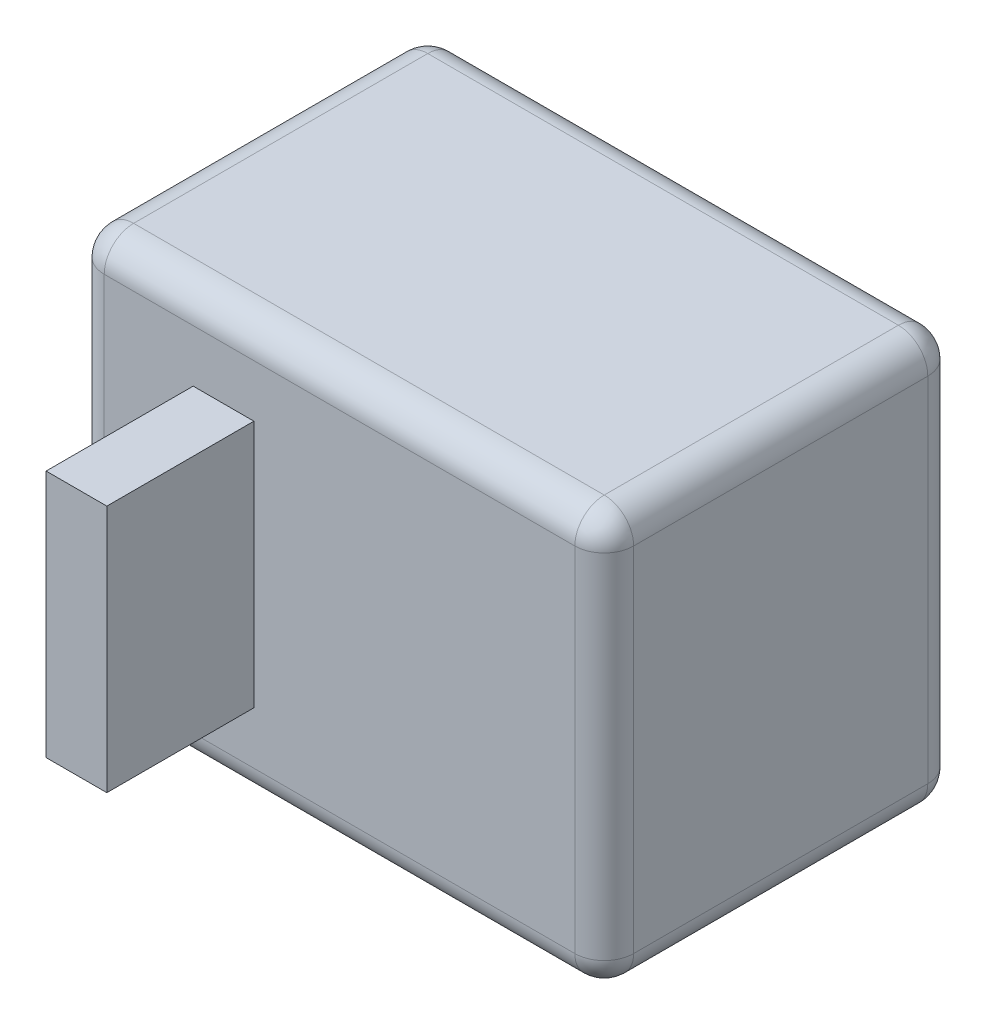
ISO-10303-21;
HEADER;
FILE_DESCRIPTION(('STEP AP214'),'2;1');
FILE_NAME('part.step','',(''),(''),'','','');
FILE_SCHEMA(('AUTOMOTIVE_DESIGN { 1 0 10303 214 1 1 1 1 }'));
ENDSEC;
DATA;
#1=APPLICATION_CONTEXT('core data for automotive mechanical design processes');
#2=APPLICATION_PROTOCOL_DEFINITION('international standard','automotive_design',2000,#1);
#3=PRODUCT_CONTEXT('',#1,'mechanical');
#4=PRODUCT('Part','Part','',(#3));
#5=PRODUCT_RELATED_PRODUCT_CATEGORY('part','',(#4));
#6=PRODUCT_DEFINITION_FORMATION('','',#4);
#7=PRODUCT_DEFINITION_CONTEXT('part definition',#1,'design');
#8=PRODUCT_DEFINITION('design','',#6,#7);
#9=PRODUCT_DEFINITION_SHAPE('','',#8);
#10=(LENGTH_UNIT() NAMED_UNIT(*) SI_UNIT(.MILLI.,.METRE.));
#11=(NAMED_UNIT(*) PLANE_ANGLE_UNIT() SI_UNIT($,.RADIAN.));
#12=(NAMED_UNIT(*) SI_UNIT($,.STERADIAN.) SOLID_ANGLE_UNIT());
#13=UNCERTAINTY_MEASURE_WITH_UNIT(LENGTH_MEASURE(1.E-05),#10,'distance_accuracy_value','');
#14=(GEOMETRIC_REPRESENTATION_CONTEXT(3) GLOBAL_UNCERTAINTY_ASSIGNED_CONTEXT((#13)) GLOBAL_UNIT_ASSIGNED_CONTEXT((#10,
#11,#12)) REPRESENTATION_CONTEXT('',''));
#15=CARTESIAN_POINT('',(0.,0.,0.));
#16=DIRECTION('',(0.,0.,1.));
#17=DIRECTION('',(1.,0.,0.));
#18=AXIS2_PLACEMENT_3D('',#15,#16,#17);
#19=CARTESIAN_POINT('',(0.,0.,12.));
#20=DIRECTION('',(0.,0.,1.));
#21=DIRECTION('',(1.,0.,0.));
#22=AXIS2_PLACEMENT_3D('',#19,#20,#21);
#23=PLANE('',#22);
#24=DIRECTION('',(0.,1.,0.));
#25=VECTOR('',#24,1.);
#26=CARTESIAN_POINT('',(7.99999999999999,7.00000000000001,12.));
#27=LINE('',#26,#25);
#28=CARTESIAN_POINT('',(8.,-5.99999999999999,12.));
#29=VERTEX_POINT('',#28);
#30=CARTESIAN_POINT('',(7.99999999999999,6.00000000000001,12.));
#31=VERTEX_POINT('',#30);
#32=EDGE_CURVE('E174',#29,#31,#27,.T.);
#33=ORIENTED_EDGE('',*,*,#32,.T.);
#34=DIRECTION('',(-1.,0.,0.));
#35=VECTOR('',#34,1.);
#36=CARTESIAN_POINT('',(-9.00000000000001,6.00000000000001,12.));
#37=LINE('',#36,#35);
#38=CARTESIAN_POINT('',(-8.,6.00000000000001,12.));
#39=VERTEX_POINT('',#38);
#40=EDGE_CURVE('E183',#31,#39,#37,.T.);
#41=ORIENTED_EDGE('',*,*,#40,.T.);
#42=DIRECTION('',(0.,-1.,0.));
#43=VECTOR('',#42,1.);
#44=CARTESIAN_POINT('',(-8.,-6.99999999999999,12.));
#45=LINE('',#44,#43);
#46=CARTESIAN_POINT('',(-8.,-5.99999999999999,12.));
#47=VERTEX_POINT('',#46);
#48=EDGE_CURVE('E181',#39,#47,#45,.T.);
#49=ORIENTED_EDGE('',*,*,#48,.T.);
#50=DIRECTION('',(1.,0.,0.));
#51=VECTOR('',#50,1.);
#52=CARTESIAN_POINT('',(9.,-5.99999999999999,12.));
#53=LINE('',#52,#51);
#54=EDGE_CURVE('E172',#47,#29,#53,.T.);
#55=ORIENTED_EDGE('',*,*,#54,.T.);
#56=EDGE_LOOP('',(#33,#41,#49,#55));
#57=FACE_BOUND('',#56,.T.);
#58=DIRECTION('',(-1.,0.,0.));
#59=VECTOR('',#58,1.);
#60=CARTESIAN_POINT('',(-4.97569113138166,4.21909512818599,12.));
#61=LINE('',#60,#59);
#62=CARTESIAN_POINT('',(-2.91081633923415,4.21909512818599,12.));
#63=VERTEX_POINT('',#62);
#64=CARTESIAN_POINT('',(-4.97569113138166,4.21909512818599,12.));
#65=VERTEX_POINT('',#64);
#66=EDGE_CURVE('E297',#63,#65,#61,.T.);
#67=ORIENTED_EDGE('',*,*,#66,.F.);
#68=DIRECTION('',(0.,1.,0.));
#69=VECTOR('',#68,1.);
#70=CARTESIAN_POINT('',(-2.91081633923415,4.21909512818599,12.));
#71=LINE('',#70,#69);
#72=CARTESIAN_POINT('',(-2.91081633923415,-4.21909512818599,12.));
#73=VERTEX_POINT('',#72);
#74=EDGE_CURVE('E170',#73,#63,#71,.T.);
#75=ORIENTED_EDGE('',*,*,#74,.F.);
#76=DIRECTION('',(1.,0.,0.));
#77=VECTOR('',#76,1.);
#78=CARTESIAN_POINT('',(-4.97569113138166,-4.21909512818599,12.));
#79=LINE('',#78,#77);
#80=CARTESIAN_POINT('',(-4.97569113138166,-4.21909512818599,12.));
#81=VERTEX_POINT('',#80);
#82=EDGE_CURVE('E166',#81,#73,#79,.T.);
#83=ORIENTED_EDGE('',*,*,#82,.F.);
#84=DIRECTION('',(0.,-1.,0.));
#85=VECTOR('',#84,1.);
#86=CARTESIAN_POINT('',(-4.97569113138166,4.21909512818599,12.));
#87=LINE('',#86,#85);
#88=EDGE_CURVE('E299',#65,#81,#87,.T.);
#89=ORIENTED_EDGE('',*,*,#88,.F.);
#90=EDGE_LOOP('',(#67,#75,#83,#89));
#91=FACE_BOUND('',#90,.T.);
#92=ADVANCED_FACE('F35',(#57,#91),#23,.T.);
#93=CARTESIAN_POINT('',(8.99999999999999,7.00000000000001,12.));
#94=DIRECTION('',(-1.,0.,0.));
#95=DIRECTION('',(0.,-1.,0.));
#96=AXIS2_PLACEMENT_3D('',#93,#94,#95);
#97=PLANE('',#96);
#98=DIRECTION('',(0.,0.,-1.));
#99=VECTOR('',#98,1.);
#100=CARTESIAN_POINT('',(8.99999999999999,6.00000000000001,12.));
#101=LINE('',#100,#99);
#102=CARTESIAN_POINT('',(8.99999999999999,6.00000000000001,1.));
#103=VERTEX_POINT('',#102);
#104=CARTESIAN_POINT('',(8.99999999999999,6.00000000000001,11.));
#105=VERTEX_POINT('',#104);
#106=EDGE_CURVE('E217',#103,#105,#101,.F.);
#107=ORIENTED_EDGE('',*,*,#106,.T.);
#108=DIRECTION('',(0.,1.,0.));
#109=VECTOR('',#108,1.);
#110=CARTESIAN_POINT('',(9.,-6.99999999999999,11.));
#111=LINE('',#110,#109);
#112=CARTESIAN_POINT('',(9.,-5.99999999999999,11.));
#113=VERTEX_POINT('',#112);
#114=EDGE_CURVE('E219',#105,#113,#111,.F.);
#115=ORIENTED_EDGE('',*,*,#114,.T.);
#116=DIRECTION('',(0.,0.,-1.));
#117=VECTOR('',#116,1.);
#118=CARTESIAN_POINT('',(9.,-5.99999999999999,12.));
#119=LINE('',#118,#117);
#120=CARTESIAN_POINT('',(9.,-5.99999999999999,1.));
#121=VERTEX_POINT('',#120);
#122=EDGE_CURVE('E213',#113,#121,#119,.T.);
#123=ORIENTED_EDGE('',*,*,#122,.T.);
#124=DIRECTION('',(0.,1.,0.));
#125=VECTOR('',#124,1.);
#126=CARTESIAN_POINT('',(8.99999999999999,7.00000000000001,1.));
#127=LINE('',#126,#125);
#128=EDGE_CURVE('E215',#121,#103,#127,.T.);
#129=ORIENTED_EDGE('',*,*,#128,.T.);
#130=EDGE_LOOP('',(#107,#115,#123,#129));
#131=FACE_BOUND('',#130,.T.);
#132=ADVANCED_FACE('F317',(#131),#97,.F.);
#133=CARTESIAN_POINT('',(-9.00000000000001,7.00000000000001,12.));
#134=DIRECTION('',(0.,-1.,0.));
#135=DIRECTION('',(0.,0.,-1.));
#136=AXIS2_PLACEMENT_3D('',#133,#134,#135);
#137=PLANE('',#136);
#138=DIRECTION('',(-1.,0.,0.));
#139=VECTOR('',#138,1.);
#140=CARTESIAN_POINT('',(-9.00000000000001,7.00000000000001,1.));
#141=LINE('',#140,#139);
#142=CARTESIAN_POINT('',(7.99999999999999,7.00000000000001,1.));
#143=VERTEX_POINT('',#142);
#144=CARTESIAN_POINT('',(-8.,7.00000000000001,1.));
#145=VERTEX_POINT('',#144);
#146=EDGE_CURVE('E188',#143,#145,#141,.T.);
#147=ORIENTED_EDGE('',*,*,#146,.T.);
#148=DIRECTION('',(0.,0.,-1.));
#149=VECTOR('',#148,1.);
#150=CARTESIAN_POINT('',(-8.,7.00000000000001,12.));
#151=LINE('',#150,#149);
#152=CARTESIAN_POINT('',(-8.,7.00000000000001,11.));
#153=VERTEX_POINT('',#152);
#154=EDGE_CURVE('E193',#145,#153,#151,.F.);
#155=ORIENTED_EDGE('',*,*,#154,.T.);
#156=DIRECTION('',(-1.,0.,0.));
#157=VECTOR('',#156,1.);
#158=CARTESIAN_POINT('',(8.99999999999999,7.00000000000001,11.));
#159=LINE('',#158,#157);
#160=CARTESIAN_POINT('',(7.99999999999999,7.00000000000001,11.));
#161=VERTEX_POINT('',#160);
#162=EDGE_CURVE('E190',#153,#161,#159,.F.);
#163=ORIENTED_EDGE('',*,*,#162,.T.);
#164=DIRECTION('',(0.,0.,-1.));
#165=VECTOR('',#164,1.);
#166=CARTESIAN_POINT('',(7.99999999999999,7.00000000000001,12.));
#167=LINE('',#166,#165);
#168=EDGE_CURVE('E186',#161,#143,#167,.T.);
#169=ORIENTED_EDGE('',*,*,#168,.T.);
#170=EDGE_LOOP('',(#147,#155,#163,#169));
#171=FACE_BOUND('',#170,.T.);
#172=ADVANCED_FACE('F323',(#171),#137,.F.);
#173=CARTESIAN_POINT('',(-9.00000000000001,7.00000000000001,12.));
#174=DIRECTION('',(1.,0.,0.));
#175=DIRECTION('',(0.,1.,0.));
#176=AXIS2_PLACEMENT_3D('',#173,#174,#175);
#177=PLANE('',#176);
#178=DIRECTION('',(0.,-1.,0.));
#179=VECTOR('',#178,1.);
#180=CARTESIAN_POINT('',(-9.00000000000001,7.00000000000001,11.));
#181=LINE('',#180,#179);
#182=CARTESIAN_POINT('',(-9.,-5.99999999999999,11.));
#183=VERTEX_POINT('',#182);
#184=CARTESIAN_POINT('',(-9.00000000000001,6.00000000000001,11.));
#185=VERTEX_POINT('',#184);
#186=EDGE_CURVE('E208',#183,#185,#181,.F.);
#187=ORIENTED_EDGE('',*,*,#186,.T.);
#188=DIRECTION('',(0.,0.,-1.));
#189=VECTOR('',#188,1.);
#190=CARTESIAN_POINT('',(-9.00000000000001,6.00000000000001,12.));
#191=LINE('',#190,#189);
#192=CARTESIAN_POINT('',(-9.00000000000001,6.00000000000001,1.));
#193=VERTEX_POINT('',#192);
#194=EDGE_CURVE('E210',#185,#193,#191,.T.);
#195=ORIENTED_EDGE('',*,*,#194,.T.);
#196=DIRECTION('',(0.,-1.,0.));
#197=VECTOR('',#196,1.);
#198=CARTESIAN_POINT('',(-9.00000000000001,7.00000000000001,1.));
#199=LINE('',#198,#197);
#200=CARTESIAN_POINT('',(-9.,-5.99999999999999,1.));
#201=VERTEX_POINT('',#200);
#202=EDGE_CURVE('E206',#193,#201,#199,.T.);
#203=ORIENTED_EDGE('',*,*,#202,.T.);
#204=DIRECTION('',(0.,0.,-1.));
#205=VECTOR('',#204,1.);
#206=CARTESIAN_POINT('',(-9.,-5.99999999999999,12.));
#207=LINE('',#206,#205);
#208=EDGE_CURVE('E204',#201,#183,#207,.F.);
#209=ORIENTED_EDGE('',*,*,#208,.T.);
#210=EDGE_LOOP('',(#187,#195,#203,#209));
#211=FACE_BOUND('',#210,.T.);
#212=ADVANCED_FACE('F336',(#211),#177,.F.);
#213=CARTESIAN_POINT('',(-9.,-6.99999999999999,12.));
#214=DIRECTION('',(0.,1.,0.));
#215=DIRECTION('',(0.,0.,1.));
#216=AXIS2_PLACEMENT_3D('',#213,#214,#215);
#217=PLANE('',#216);
#218=DIRECTION('',(1.,0.,0.));
#219=VECTOR('',#218,1.);
#220=CARTESIAN_POINT('',(-9.,-6.99999999999999,11.));
#221=LINE('',#220,#219);
#222=CARTESIAN_POINT('',(8.,-6.99999999999999,11.));
#223=VERTEX_POINT('',#222);
#224=CARTESIAN_POINT('',(-8.,-6.99999999999999,11.));
#225=VERTEX_POINT('',#224);
#226=EDGE_CURVE('E44',#223,#225,#221,.F.);
#227=ORIENTED_EDGE('',*,*,#226,.T.);
#228=DIRECTION('',(0.,0.,-1.));
#229=VECTOR('',#228,1.);
#230=CARTESIAN_POINT('',(-8.,-6.99999999999999,12.));
#231=LINE('',#230,#229);
#232=CARTESIAN_POINT('',(-8.,-6.99999999999999,1.));
#233=VERTEX_POINT('',#232);
#234=EDGE_CURVE('E11',#225,#233,#231,.T.);
#235=ORIENTED_EDGE('',*,*,#234,.T.);
#236=DIRECTION('',(1.,0.,0.));
#237=VECTOR('',#236,1.);
#238=CARTESIAN_POINT('',(-9.,-6.99999999999999,1.));
#239=LINE('',#238,#237);
#240=CARTESIAN_POINT('',(8.,-6.99999999999999,1.));
#241=VERTEX_POINT('',#240);
#242=EDGE_CURVE('E222',#233,#241,#239,.T.);
#243=ORIENTED_EDGE('',*,*,#242,.T.);
#244=DIRECTION('',(0.,0.,-1.));
#245=VECTOR('',#244,1.);
#246=CARTESIAN_POINT('',(8.,-6.99999999999999,12.));
#247=LINE('',#246,#245);
#248=EDGE_CURVE('E55',#241,#223,#247,.F.);
#249=ORIENTED_EDGE('',*,*,#248,.T.);
#250=EDGE_LOOP('',(#227,#235,#243,#249));
#251=FACE_BOUND('',#250,.T.);
#252=ADVANCED_FACE('F332',(#251),#217,.F.);
#253=CARTESIAN_POINT('',(0.,0.,0.));
#254=DIRECTION('',(0.,0.,1.));
#255=DIRECTION('',(1.,0.,0.));
#256=AXIS2_PLACEMENT_3D('',#253,#254,#255);
#257=PLANE('',#256);
#258=DIRECTION('',(0.,-1.,0.));
#259=VECTOR('',#258,1.);
#260=CARTESIAN_POINT('',(-8.,0.,0.));
#261=LINE('',#260,#259);
#262=CARTESIAN_POINT('',(-8.,-5.99999999999999,0.));
#263=VERTEX_POINT('',#262);
#264=CARTESIAN_POINT('',(-8.,6.00000000000001,0.));
#265=VERTEX_POINT('',#264);
#266=EDGE_CURVE('E199',#263,#265,#261,.F.);
#267=ORIENTED_EDGE('',*,*,#266,.T.);
#268=DIRECTION('',(-1.,0.,0.));
#269=VECTOR('',#268,1.);
#270=CARTESIAN_POINT('',(0.,6.00000000000001,0.));
#271=LINE('',#270,#269);
#272=CARTESIAN_POINT('',(7.99999999999999,6.00000000000001,0.));
#273=VERTEX_POINT('',#272);
#274=EDGE_CURVE('E201',#265,#273,#271,.F.);
#275=ORIENTED_EDGE('',*,*,#274,.T.);
#276=DIRECTION('',(0.,1.,0.));
#277=VECTOR('',#276,1.);
#278=CARTESIAN_POINT('',(7.99999999999999,0.,0.));
#279=LINE('',#278,#277);
#280=CARTESIAN_POINT('',(8.,-5.99999999999999,0.));
#281=VERTEX_POINT('',#280);
#282=EDGE_CURVE('E197',#273,#281,#279,.F.);
#283=ORIENTED_EDGE('',*,*,#282,.T.);
#284=DIRECTION('',(1.,0.,0.));
#285=VECTOR('',#284,1.);
#286=CARTESIAN_POINT('',(0.,-5.99999999999999,0.));
#287=LINE('',#286,#285);
#288=EDGE_CURVE('E195',#281,#263,#287,.F.);
#289=ORIENTED_EDGE('',*,*,#288,.T.);
#290=EDGE_LOOP('',(#267,#275,#283,#289));
#291=FACE_BOUND('',#290,.T.);
#292=ADVANCED_FACE('F329',(#291),#257,.F.);
#293=CARTESIAN_POINT('',(-2.91081633923415,4.21909512818599,17.));
#294=DIRECTION('',(-1.,0.,0.));
#295=DIRECTION('',(0.,0.,1.));
#296=AXIS2_PLACEMENT_3D('',#293,#294,#295);
#297=PLANE('',#296);
#298=ORIENTED_EDGE('',*,*,#74,.T.);
#299=DIRECTION('',(0.,0.,-1.));
#300=VECTOR('',#299,1.);
#301=CARTESIAN_POINT('',(-2.91081633923415,4.21909512818599,17.));
#302=LINE('',#301,#300);
#303=CARTESIAN_POINT('',(-2.91081633923415,4.21909512818599,17.));
#304=VERTEX_POINT('',#303);
#305=EDGE_CURVE('E150',#304,#63,#302,.T.);
#306=ORIENTED_EDGE('',*,*,#305,.F.);
#307=DIRECTION('',(0.,1.,0.));
#308=VECTOR('',#307,1.);
#309=CARTESIAN_POINT('',(-2.91081633923415,4.21909512818599,17.));
#310=LINE('',#309,#308);
#311=CARTESIAN_POINT('',(-2.91081633923415,-4.21909512818599,17.));
#312=VERTEX_POINT('',#311);
#313=EDGE_CURVE('E157',#312,#304,#310,.T.);
#314=ORIENTED_EDGE('',*,*,#313,.F.);
#315=DIRECTION('',(0.,0.,-1.));
#316=VECTOR('',#315,1.);
#317=CARTESIAN_POINT('',(-2.91081633923415,-4.21909512818599,17.));
#318=LINE('',#317,#316);
#319=EDGE_CURVE('E307',#312,#73,#318,.T.);
#320=ORIENTED_EDGE('',*,*,#319,.T.);
#321=EDGE_LOOP('',(#298,#306,#314,#320));
#322=FACE_BOUND('',#321,.T.);
#323=ADVANCED_FACE('F168',(#322),#297,.F.);
#324=CARTESIAN_POINT('',(-4.97569113138166,4.21909512818599,17.));
#325=DIRECTION('',(0.,-1.,0.));
#326=DIRECTION('',(0.,0.,-1.));
#327=AXIS2_PLACEMENT_3D('',#324,#325,#326);
#328=PLANE('',#327);
#329=ORIENTED_EDGE('',*,*,#66,.T.);
#330=DIRECTION('',(0.,0.,-1.));
#331=VECTOR('',#330,1.);
#332=CARTESIAN_POINT('',(-4.97569113138166,4.21909512818599,17.));
#333=LINE('',#332,#331);
#334=CARTESIAN_POINT('',(-4.97569113138166,4.21909512818599,17.));
#335=VERTEX_POINT('',#334);
#336=EDGE_CURVE('E153',#335,#65,#333,.T.);
#337=ORIENTED_EDGE('',*,*,#336,.F.);
#338=DIRECTION('',(-1.,0.,0.));
#339=VECTOR('',#338,1.);
#340=CARTESIAN_POINT('',(-4.97569113138166,4.21909512818599,17.));
#341=LINE('',#340,#339);
#342=EDGE_CURVE('E146',#304,#335,#341,.T.);
#343=ORIENTED_EDGE('',*,*,#342,.F.);
#344=ORIENTED_EDGE('',*,*,#305,.T.);
#345=EDGE_LOOP('',(#329,#337,#343,#344));
#346=FACE_BOUND('',#345,.T.);
#347=ADVANCED_FACE('F148',(#346),#328,.F.);
#348=CARTESIAN_POINT('',(-4.97569113138166,4.21909512818599,17.));
#349=DIRECTION('',(1.,0.,0.));
#350=DIRECTION('',(0.,0.,-1.));
#351=AXIS2_PLACEMENT_3D('',#348,#349,#350);
#352=PLANE('',#351);
#353=ORIENTED_EDGE('',*,*,#88,.T.);
#354=DIRECTION('',(0.,0.,-1.));
#355=VECTOR('',#354,1.);
#356=CARTESIAN_POINT('',(-4.97569113138166,-4.21909512818599,17.));
#357=LINE('',#356,#355);
#358=CARTESIAN_POINT('',(-4.97569113138166,-4.21909512818599,17.));
#359=VERTEX_POINT('',#358);
#360=EDGE_CURVE('E176',#359,#81,#357,.T.);
#361=ORIENTED_EDGE('',*,*,#360,.F.);
#362=DIRECTION('',(0.,-1.,0.));
#363=VECTOR('',#362,1.);
#364=CARTESIAN_POINT('',(-4.97569113138166,4.21909512818599,17.));
#365=LINE('',#364,#363);
#366=EDGE_CURVE('E156',#335,#359,#365,.T.);
#367=ORIENTED_EDGE('',*,*,#366,.F.);
#368=ORIENTED_EDGE('',*,*,#336,.T.);
#369=EDGE_LOOP('',(#353,#361,#367,#368));
#370=FACE_BOUND('',#369,.T.);
#371=ADVANCED_FACE('F314',(#370),#352,.F.);
#372=CARTESIAN_POINT('',(-4.97569113138166,-4.21909512818599,17.));
#373=DIRECTION('',(0.,1.,0.));
#374=DIRECTION('',(0.,0.,1.));
#375=AXIS2_PLACEMENT_3D('',#372,#373,#374);
#376=PLANE('',#375);
#377=ORIENTED_EDGE('',*,*,#82,.T.);
#378=ORIENTED_EDGE('',*,*,#319,.F.);
#379=DIRECTION('',(1.,0.,0.));
#380=VECTOR('',#379,1.);
#381=CARTESIAN_POINT('',(-4.97569113138166,-4.21909512818599,17.));
#382=LINE('',#381,#380);
#383=EDGE_CURVE('E162',#359,#312,#382,.T.);
#384=ORIENTED_EDGE('',*,*,#383,.F.);
#385=ORIENTED_EDGE('',*,*,#360,.T.);
#386=EDGE_LOOP('',(#377,#378,#384,#385));
#387=FACE_BOUND('',#386,.T.);
#388=ADVANCED_FACE('F310',(#387),#376,.F.);
#389=CARTESIAN_POINT('',(0.,0.,17.));
#390=DIRECTION('',(0.,0.,1.));
#391=DIRECTION('',(1.,0.,0.));
#392=AXIS2_PLACEMENT_3D('',#389,#390,#391);
#393=PLANE('',#392);
#394=ORIENTED_EDGE('',*,*,#313,.T.);
#395=ORIENTED_EDGE('',*,*,#342,.T.);
#396=ORIENTED_EDGE('',*,*,#366,.T.);
#397=ORIENTED_EDGE('',*,*,#383,.T.);
#398=EDGE_LOOP('',(#394,#395,#396,#397));
#399=FACE_BOUND('',#398,.T.);
#400=ADVANCED_FACE('F160',(#399),#393,.T.);
#401=CARTESIAN_POINT('',(-9.,-5.99999999999999,1.));
#402=DIRECTION('',(1.,0.,0.));
#403=DIRECTION('',(0.,0.,-1.));
#404=AXIS2_PLACEMENT_3D('',#401,#402,#403);
#405=CYLINDRICAL_SURFACE('',#404,1.);
#406=CARTESIAN_POINT('',(8.,-5.99999999999999,1.));
#407=DIRECTION('',(1.,0.,0.));
#408=DIRECTION('',(0.,0.,-1.));
#409=AXIS2_PLACEMENT_3D('',#406,#407,#408);
#410=CIRCLE('',#409,1.);
#411=EDGE_CURVE('E39',#241,#281,#410,.T.);
#412=ORIENTED_EDGE('',*,*,#411,.F.);
#413=ORIENTED_EDGE('',*,*,#242,.F.);
#414=CARTESIAN_POINT('',(-8.,-5.99999999999999,1.));
#415=DIRECTION('',(-1.,0.,0.));
#416=DIRECTION('',(0.,0.,1.));
#417=AXIS2_PLACEMENT_3D('',#414,#415,#416);
#418=CIRCLE('',#417,1.);
#419=EDGE_CURVE('E285',#263,#233,#418,.T.);
#420=ORIENTED_EDGE('',*,*,#419,.F.);
#421=ORIENTED_EDGE('',*,*,#288,.F.);
#422=EDGE_LOOP('',(#412,#413,#420,#421));
#423=FACE_BOUND('',#422,.T.);
#424=ADVANCED_FACE('F37',(#423),#405,.T.);
#425=CARTESIAN_POINT('',(8.,-5.99999999999999,1.));
#426=DIRECTION('',(0.,0.,1.));
#427=DIRECTION('',(1.,0.,0.));
#428=AXIS2_PLACEMENT_3D('',#425,#426,#427);
#429=SPHERICAL_SURFACE('',#428,1.);
#430=CARTESIAN_POINT('',(8.,-5.99999999999999,1.));
#431=DIRECTION('',(0.,0.,-1.));
#432=DIRECTION('',(-1.,0.,0.));
#433=AXIS2_PLACEMENT_3D('',#430,#431,#432);
#434=CIRCLE('',#433,1.);
#435=EDGE_CURVE('E280',#241,#121,#434,.F.);
#436=ORIENTED_EDGE('',*,*,#435,.F.);
#437=ORIENTED_EDGE('',*,*,#411,.T.);
#438=CARTESIAN_POINT('',(8.,-5.99999999999999,1.));
#439=DIRECTION('',(0.,-1.,0.));
#440=DIRECTION('',(1.,0.,0.));
#441=AXIS2_PLACEMENT_3D('',#438,#439,#440);
#442=CIRCLE('',#441,1.);
#443=EDGE_CURVE('E283',#121,#281,#442,.F.);
#444=ORIENTED_EDGE('',*,*,#443,.F.);
#445=EDGE_LOOP('',(#436,#437,#444));
#446=FACE_BOUND('',#445,.T.);
#447=ADVANCED_FACE('F413',(#446),#429,.T.);
#448=CARTESIAN_POINT('',(-8.,-5.99999999999999,1.));
#449=DIRECTION('',(0.,0.,1.));
#450=DIRECTION('',(1.,0.,0.));
#451=AXIS2_PLACEMENT_3D('',#448,#449,#450);
#452=SPHERICAL_SURFACE('',#451,1.);
#453=CARTESIAN_POINT('',(-8.,-5.99999999999999,1.));
#454=DIRECTION('',(0.,-1.,0.));
#455=DIRECTION('',(0.,0.,-1.));
#456=AXIS2_PLACEMENT_3D('',#453,#454,#455);
#457=CIRCLE('',#456,1.);
#458=EDGE_CURVE('E275',#263,#201,#457,.F.);
#459=ORIENTED_EDGE('',*,*,#458,.F.);
#460=ORIENTED_EDGE('',*,*,#419,.T.);
#461=CARTESIAN_POINT('',(-8.,-5.99999999999999,1.));
#462=DIRECTION('',(0.,0.,-1.));
#463=DIRECTION('',(-1.,0.,0.));
#464=AXIS2_PLACEMENT_3D('',#461,#462,#463);
#465=CIRCLE('',#464,1.);
#466=EDGE_CURVE('E278',#201,#233,#465,.F.);
#467=ORIENTED_EDGE('',*,*,#466,.F.);
#468=EDGE_LOOP('',(#459,#460,#467));
#469=FACE_BOUND('',#468,.T.);
#470=ADVANCED_FACE('F410',(#469),#452,.T.);
#471=CARTESIAN_POINT('',(7.99999999999999,7.00000000000001,1.));
#472=DIRECTION('',(0.,1.,0.));
#473=DIRECTION('',(-1.,0.,0.));
#474=AXIS2_PLACEMENT_3D('',#471,#472,#473);
#475=CYLINDRICAL_SURFACE('',#474,1.);
#476=ORIENTED_EDGE('',*,*,#443,.T.);
#477=ORIENTED_EDGE('',*,*,#282,.F.);
#478=CARTESIAN_POINT('',(7.99999999999999,6.00000000000001,1.));
#479=DIRECTION('',(0.,1.,0.));
#480=DIRECTION('',(0.,0.,1.));
#481=AXIS2_PLACEMENT_3D('',#478,#479,#480);
#482=CIRCLE('',#481,1.);
#483=EDGE_CURVE('E270',#103,#273,#482,.T.);
#484=ORIENTED_EDGE('',*,*,#483,.F.);
#485=ORIENTED_EDGE('',*,*,#128,.F.);
#486=EDGE_LOOP('',(#476,#477,#484,#485));
#487=FACE_BOUND('',#486,.T.);
#488=ADVANCED_FACE('F406',(#487),#475,.T.);
#489=CARTESIAN_POINT('',(8.,-5.99999999999999,12.));
#490=DIRECTION('',(0.,0.,-1.));
#491=DIRECTION('',(-1.,0.,0.));
#492=AXIS2_PLACEMENT_3D('',#489,#490,#491);
#493=CYLINDRICAL_SURFACE('',#492,1.);
#494=ORIENTED_EDGE('',*,*,#435,.T.);
#495=ORIENTED_EDGE('',*,*,#122,.F.);
#496=CARTESIAN_POINT('',(8.,-5.99999999999999,11.));
#497=DIRECTION('',(0.,0.,1.));
#498=DIRECTION('',(1.,0.,0.));
#499=AXIS2_PLACEMENT_3D('',#496,#497,#498);
#500=CIRCLE('',#499,1.);
#501=EDGE_CURVE('E267',#223,#113,#500,.T.);
#502=ORIENTED_EDGE('',*,*,#501,.F.);
#503=ORIENTED_EDGE('',*,*,#248,.F.);
#504=EDGE_LOOP('',(#494,#495,#502,#503));
#505=FACE_BOUND('',#504,.T.);
#506=ADVANCED_FACE('F402',(#505),#493,.T.);
#507=CARTESIAN_POINT('',(0.,-5.99999999999999,11.));
#508=DIRECTION('',(-1.,0.,0.));
#509=DIRECTION('',(0.,0.,1.));
#510=AXIS2_PLACEMENT_3D('',#507,#508,#509);
#511=CYLINDRICAL_SURFACE('',#510,1.);
#512=CARTESIAN_POINT('',(-8.,-5.99999999999999,11.));
#513=DIRECTION('',(-1.,0.,0.));
#514=DIRECTION('',(0.,0.,1.));
#515=AXIS2_PLACEMENT_3D('',#512,#513,#514);
#516=CIRCLE('',#515,1.);
#517=EDGE_CURVE('E261',#225,#47,#516,.T.);
#518=ORIENTED_EDGE('',*,*,#517,.F.);
#519=ORIENTED_EDGE('',*,*,#226,.F.);
#520=CARTESIAN_POINT('',(8.,-5.99999999999999,11.));
#521=DIRECTION('',(1.,0.,0.));
#522=DIRECTION('',(0.,0.,-1.));
#523=AXIS2_PLACEMENT_3D('',#520,#521,#522);
#524=CIRCLE('',#523,1.);
#525=EDGE_CURVE('E264',#29,#223,#524,.T.);
#526=ORIENTED_EDGE('',*,*,#525,.F.);
#527=ORIENTED_EDGE('',*,*,#54,.F.);
#528=EDGE_LOOP('',(#518,#519,#526,#527));
#529=FACE_BOUND('',#528,.T.);
#530=ADVANCED_FACE('F398',(#529),#511,.T.);
#531=CARTESIAN_POINT('',(-8.,-5.99999999999999,12.));
#532=DIRECTION('',(0.,0.,-1.));
#533=DIRECTION('',(-1.,0.,0.));
#534=AXIS2_PLACEMENT_3D('',#531,#532,#533);
#535=CYLINDRICAL_SURFACE('',#534,1.);
#536=ORIENTED_EDGE('',*,*,#466,.T.);
#537=ORIENTED_EDGE('',*,*,#234,.F.);
#538=CARTESIAN_POINT('',(-8.,-5.99999999999999,11.));
#539=DIRECTION('',(0.,0.,1.));
#540=DIRECTION('',(1.,0.,0.));
#541=AXIS2_PLACEMENT_3D('',#538,#539,#540);
#542=CIRCLE('',#541,1.);
#543=EDGE_CURVE('E258',#183,#225,#542,.T.);
#544=ORIENTED_EDGE('',*,*,#543,.F.);
#545=ORIENTED_EDGE('',*,*,#208,.F.);
#546=EDGE_LOOP('',(#536,#537,#544,#545));
#547=FACE_BOUND('',#546,.T.);
#548=ADVANCED_FACE('F394',(#547),#535,.T.);
#549=CARTESIAN_POINT('',(-8.,7.00000000000001,1.));
#550=DIRECTION('',(0.,-1.,0.));
#551=DIRECTION('',(1.,0.,0.));
#552=AXIS2_PLACEMENT_3D('',#549,#550,#551);
#553=CYLINDRICAL_SURFACE('',#552,1.);
#554=ORIENTED_EDGE('',*,*,#458,.T.);
#555=ORIENTED_EDGE('',*,*,#202,.F.);
#556=CARTESIAN_POINT('',(-8.,6.00000000000001,1.));
#557=DIRECTION('',(0.,1.,0.));
#558=DIRECTION('',(0.,0.,1.));
#559=AXIS2_PLACEMENT_3D('',#556,#557,#558);
#560=CIRCLE('',#559,1.);
#561=EDGE_CURVE('E255',#265,#193,#560,.T.);
#562=ORIENTED_EDGE('',*,*,#561,.F.);
#563=ORIENTED_EDGE('',*,*,#266,.F.);
#564=EDGE_LOOP('',(#554,#555,#562,#563));
#565=FACE_BOUND('',#564,.T.);
#566=ADVANCED_FACE('F390',(#565),#553,.T.);
#567=CARTESIAN_POINT('',(-9.00000000000001,6.00000000000001,1.));
#568=DIRECTION('',(-1.,0.,0.));
#569=DIRECTION('',(0.,0.,1.));
#570=AXIS2_PLACEMENT_3D('',#567,#568,#569);
#571=CYLINDRICAL_SURFACE('',#570,1.);
#572=CARTESIAN_POINT('',(7.99999999999999,6.00000000000001,1.));
#573=DIRECTION('',(1.,0.,0.));
#574=DIRECTION('',(0.,0.,-1.));
#575=AXIS2_PLACEMENT_3D('',#572,#573,#574);
#576=CIRCLE('',#575,1.);
#577=EDGE_CURVE('E272',#273,#143,#576,.T.);
#578=ORIENTED_EDGE('',*,*,#577,.F.);
#579=ORIENTED_EDGE('',*,*,#274,.F.);
#580=CARTESIAN_POINT('',(-8.,6.00000000000001,1.));
#581=DIRECTION('',(-1.,0.,0.));
#582=DIRECTION('',(0.,0.,1.));
#583=AXIS2_PLACEMENT_3D('',#580,#581,#582);
#584=CIRCLE('',#583,1.);
#585=EDGE_CURVE('E252',#145,#265,#584,.T.);
#586=ORIENTED_EDGE('',*,*,#585,.F.);
#587=ORIENTED_EDGE('',*,*,#146,.F.);
#588=EDGE_LOOP('',(#578,#579,#586,#587));
#589=FACE_BOUND('',#588,.T.);
#590=ADVANCED_FACE('F386',(#589),#571,.T.);
#591=CARTESIAN_POINT('',(7.99999999999999,6.00000000000001,1.));
#592=DIRECTION('',(0.,0.,1.));
#593=DIRECTION('',(1.,0.,0.));
#594=AXIS2_PLACEMENT_3D('',#591,#592,#593);
#595=SPHERICAL_SURFACE('',#594,1.);
#596=ORIENTED_EDGE('',*,*,#483,.T.);
#597=ORIENTED_EDGE('',*,*,#577,.T.);
#598=CARTESIAN_POINT('',(7.99999999999999,6.00000000000001,1.));
#599=DIRECTION('',(0.,0.,-1.));
#600=DIRECTION('',(-1.,0.,0.));
#601=AXIS2_PLACEMENT_3D('',#598,#599,#600);
#602=CIRCLE('',#601,1.);
#603=EDGE_CURVE('E249',#103,#143,#602,.F.);
#604=ORIENTED_EDGE('',*,*,#603,.F.);
#605=EDGE_LOOP('',(#596,#597,#604));
#606=FACE_BOUND('',#605,.T.);
#607=ADVANCED_FACE('F382',(#606),#595,.T.);
#608=CARTESIAN_POINT('',(8.,-5.99999999999999,11.));
#609=DIRECTION('',(0.,0.,1.));
#610=DIRECTION('',(1.,0.,0.));
#611=AXIS2_PLACEMENT_3D('',#608,#609,#610);
#612=SPHERICAL_SURFACE('',#611,1.);
#613=ORIENTED_EDGE('',*,*,#525,.T.);
#614=ORIENTED_EDGE('',*,*,#501,.T.);
#615=CARTESIAN_POINT('',(8.,-5.99999999999999,11.));
#616=DIRECTION('',(0.,-1.,0.));
#617=DIRECTION('',(0.,0.,-1.));
#618=AXIS2_PLACEMENT_3D('',#615,#616,#617);
#619=CIRCLE('',#618,1.);
#620=EDGE_CURVE('E247',#29,#113,#619,.F.);
#621=ORIENTED_EDGE('',*,*,#620,.F.);
#622=EDGE_LOOP('',(#613,#614,#621));
#623=FACE_BOUND('',#622,.T.);
#624=ADVANCED_FACE('F378',(#623),#612,.T.);
#625=CARTESIAN_POINT('',(-8.,-5.99999999999999,11.));
#626=DIRECTION('',(0.,0.,1.));
#627=DIRECTION('',(1.,0.,0.));
#628=AXIS2_PLACEMENT_3D('',#625,#626,#627);
#629=SPHERICAL_SURFACE('',#628,1.);
#630=ORIENTED_EDGE('',*,*,#543,.T.);
#631=ORIENTED_EDGE('',*,*,#517,.T.);
#632=CARTESIAN_POINT('',(-8.,-5.99999999999999,11.));
#633=DIRECTION('',(0.,-1.,0.));
#634=DIRECTION('',(0.,0.,-1.));
#635=AXIS2_PLACEMENT_3D('',#632,#633,#634);
#636=CIRCLE('',#635,1.);
#637=EDGE_CURVE('E244',#183,#47,#636,.F.);
#638=ORIENTED_EDGE('',*,*,#637,.F.);
#639=EDGE_LOOP('',(#630,#631,#638));
#640=FACE_BOUND('',#639,.T.);
#641=ADVANCED_FACE('F374',(#640),#629,.T.);
#642=CARTESIAN_POINT('',(-8.,6.00000000000001,1.));
#643=DIRECTION('',(0.,0.,1.));
#644=DIRECTION('',(1.,0.,0.));
#645=AXIS2_PLACEMENT_3D('',#642,#643,#644);
#646=SPHERICAL_SURFACE('',#645,1.);
#647=ORIENTED_EDGE('',*,*,#585,.T.);
#648=ORIENTED_EDGE('',*,*,#561,.T.);
#649=CARTESIAN_POINT('',(-8.,6.00000000000001,1.));
#650=DIRECTION('',(0.,0.,-1.));
#651=DIRECTION('',(-1.,0.,0.));
#652=AXIS2_PLACEMENT_3D('',#649,#650,#651);
#653=CIRCLE('',#652,1.);
#654=EDGE_CURVE('E242',#145,#193,#653,.F.);
#655=ORIENTED_EDGE('',*,*,#654,.F.);
#656=EDGE_LOOP('',(#647,#648,#655));
#657=FACE_BOUND('',#656,.T.);
#658=ADVANCED_FACE('F370',(#657),#646,.T.);
#659=CARTESIAN_POINT('',(7.99999999999999,6.00000000000001,12.));
#660=DIRECTION('',(0.,0.,-1.));
#661=DIRECTION('',(-1.,0.,0.));
#662=AXIS2_PLACEMENT_3D('',#659,#660,#661);
#663=CYLINDRICAL_SURFACE('',#662,1.);
#664=ORIENTED_EDGE('',*,*,#603,.T.);
#665=ORIENTED_EDGE('',*,*,#168,.F.);
#666=CARTESIAN_POINT('',(7.99999999999999,6.00000000000001,11.));
#667=DIRECTION('',(0.,0.,1.));
#668=DIRECTION('',(1.,0.,0.));
#669=AXIS2_PLACEMENT_3D('',#666,#667,#668);
#670=CIRCLE('',#669,1.);
#671=EDGE_CURVE('E239',#105,#161,#670,.T.);
#672=ORIENTED_EDGE('',*,*,#671,.F.);
#673=ORIENTED_EDGE('',*,*,#106,.F.);
#674=EDGE_LOOP('',(#664,#665,#672,#673));
#675=FACE_BOUND('',#674,.T.);
#676=ADVANCED_FACE('F366',(#675),#663,.T.);
#677=CARTESIAN_POINT('',(7.99999999999999,0.,11.));
#678=DIRECTION('',(0.,-1.,0.));
#679=DIRECTION('',(1.,0.,0.));
#680=AXIS2_PLACEMENT_3D('',#677,#678,#679);
#681=CYLINDRICAL_SURFACE('',#680,1.);
#682=ORIENTED_EDGE('',*,*,#620,.T.);
#683=ORIENTED_EDGE('',*,*,#114,.F.);
#684=CARTESIAN_POINT('',(7.99999999999999,6.00000000000001,11.));
#685=DIRECTION('',(0.,1.,0.));
#686=DIRECTION('',(0.,0.,1.));
#687=AXIS2_PLACEMENT_3D('',#684,#685,#686);
#688=CIRCLE('',#687,1.);
#689=EDGE_CURVE('E236',#31,#105,#688,.T.);
#690=ORIENTED_EDGE('',*,*,#689,.F.);
#691=ORIENTED_EDGE('',*,*,#32,.F.);
#692=EDGE_LOOP('',(#682,#683,#690,#691));
#693=FACE_BOUND('',#692,.T.);
#694=ADVANCED_FACE('F362',(#693),#681,.T.);
#695=CARTESIAN_POINT('',(-8.,0.,11.));
#696=DIRECTION('',(0.,1.,0.));
#697=DIRECTION('',(-1.,0.,0.));
#698=AXIS2_PLACEMENT_3D('',#695,#696,#697);
#699=CYLINDRICAL_SURFACE('',#698,1.);
#700=ORIENTED_EDGE('',*,*,#637,.T.);
#701=ORIENTED_EDGE('',*,*,#48,.F.);
#702=CARTESIAN_POINT('',(-8.,6.00000000000001,11.));
#703=DIRECTION('',(0.,1.,0.));
#704=DIRECTION('',(0.,0.,1.));
#705=AXIS2_PLACEMENT_3D('',#702,#703,#704);
#706=CIRCLE('',#705,1.);
#707=EDGE_CURVE('E233',#185,#39,#706,.T.);
#708=ORIENTED_EDGE('',*,*,#707,.F.);
#709=ORIENTED_EDGE('',*,*,#186,.F.);
#710=EDGE_LOOP('',(#700,#701,#708,#709));
#711=FACE_BOUND('',#710,.T.);
#712=ADVANCED_FACE('F358',(#711),#699,.T.);
#713=CARTESIAN_POINT('',(-8.,6.00000000000001,12.));
#714=DIRECTION('',(0.,0.,-1.));
#715=DIRECTION('',(-1.,0.,0.));
#716=AXIS2_PLACEMENT_3D('',#713,#714,#715);
#717=CYLINDRICAL_SURFACE('',#716,1.);
#718=ORIENTED_EDGE('',*,*,#654,.T.);
#719=ORIENTED_EDGE('',*,*,#194,.F.);
#720=CARTESIAN_POINT('',(-8.,6.00000000000001,11.));
#721=DIRECTION('',(0.,0.,1.));
#722=DIRECTION('',(1.,0.,0.));
#723=AXIS2_PLACEMENT_3D('',#720,#721,#722);
#724=CIRCLE('',#723,1.);
#725=EDGE_CURVE('E230',#153,#185,#724,.T.);
#726=ORIENTED_EDGE('',*,*,#725,.F.);
#727=ORIENTED_EDGE('',*,*,#154,.F.);
#728=EDGE_LOOP('',(#718,#719,#726,#727));
#729=FACE_BOUND('',#728,.T.);
#730=ADVANCED_FACE('F354',(#729),#717,.T.);
#731=CARTESIAN_POINT('',(7.99999999999999,6.00000000000001,11.));
#732=DIRECTION('',(0.,0.,1.));
#733=DIRECTION('',(1.,0.,0.));
#734=AXIS2_PLACEMENT_3D('',#731,#732,#733);
#735=SPHERICAL_SURFACE('',#734,1.);
#736=ORIENTED_EDGE('',*,*,#689,.T.);
#737=ORIENTED_EDGE('',*,*,#671,.T.);
#738=CARTESIAN_POINT('',(7.99999999999999,6.00000000000001,11.));
#739=DIRECTION('',(1.,0.,0.));
#740=DIRECTION('',(0.,0.,-1.));
#741=AXIS2_PLACEMENT_3D('',#738,#739,#740);
#742=CIRCLE('',#741,1.);
#743=EDGE_CURVE('E228',#31,#161,#742,.F.);
#744=ORIENTED_EDGE('',*,*,#743,.F.);
#745=EDGE_LOOP('',(#736,#737,#744));
#746=FACE_BOUND('',#745,.T.);
#747=ADVANCED_FACE('F350',(#746),#735,.T.);
#748=CARTESIAN_POINT('',(-8.,6.00000000000001,11.));
#749=DIRECTION('',(0.,0.,1.));
#750=DIRECTION('',(1.,0.,0.));
#751=AXIS2_PLACEMENT_3D('',#748,#749,#750);
#752=SPHERICAL_SURFACE('',#751,1.);
#753=ORIENTED_EDGE('',*,*,#725,.T.);
#754=ORIENTED_EDGE('',*,*,#707,.T.);
#755=CARTESIAN_POINT('',(-8.,6.00000000000001,11.));
#756=DIRECTION('',(-1.,0.,0.));
#757=DIRECTION('',(0.,0.,1.));
#758=AXIS2_PLACEMENT_3D('',#755,#756,#757);
#759=CIRCLE('',#758,1.);
#760=EDGE_CURVE('E226',#153,#39,#759,.F.);
#761=ORIENTED_EDGE('',*,*,#760,.F.);
#762=EDGE_LOOP('',(#753,#754,#761));
#763=FACE_BOUND('',#762,.T.);
#764=ADVANCED_FACE('F346',(#763),#752,.T.);
#765=CARTESIAN_POINT('',(0.,6.00000000000001,11.));
#766=DIRECTION('',(1.,0.,0.));
#767=DIRECTION('',(0.,0.,-1.));
#768=AXIS2_PLACEMENT_3D('',#765,#766,#767);
#769=CYLINDRICAL_SURFACE('',#768,1.);
#770=ORIENTED_EDGE('',*,*,#743,.T.);
#771=ORIENTED_EDGE('',*,*,#162,.F.);
#772=ORIENTED_EDGE('',*,*,#760,.T.);
#773=ORIENTED_EDGE('',*,*,#40,.F.);
#774=EDGE_LOOP('',(#770,#771,#772,#773));
#775=FACE_BOUND('',#774,.T.);
#776=ADVANCED_FACE('F343',(#775),#769,.T.);
#777=CLOSED_SHELL('',(#92,#132,#172,#212,#252,#292,#323,#347,#371,#388,#400,#424,#447,#470,#488,
#506,#530,#548,#566,#590,#607,#624,#641,#658,#676,#694,#712,#730,#747,#764,#776));
#778=MANIFOLD_SOLID_BREP('B2',#777);
#779=ADVANCED_BREP_SHAPE_REPRESENTATION('',(#18,#778),#14);
#780=SHAPE_DEFINITION_REPRESENTATION(#9,#779);
ENDSEC;
END-ISO-10303-21;
